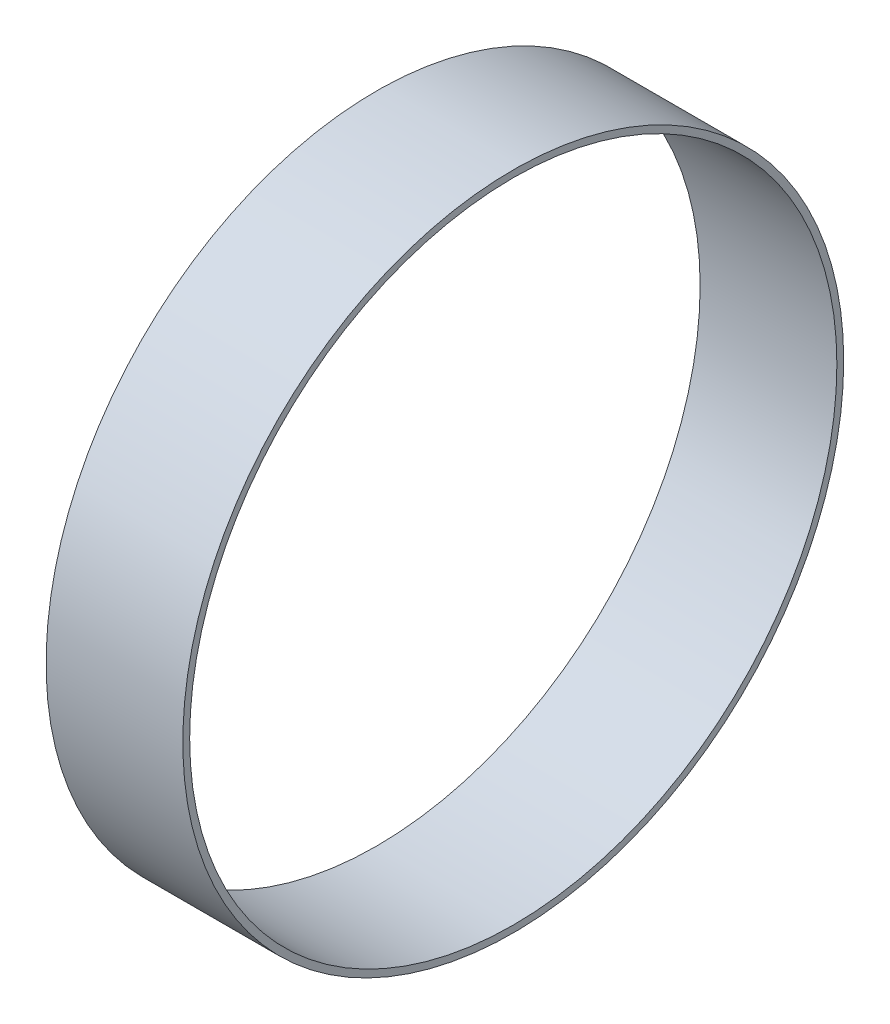
ISO-10303-21;
HEADER;
FILE_DESCRIPTION(('STEP AP214'),'2;1');
FILE_NAME('part.step','',(''),(''),'','','');
FILE_SCHEMA(('AUTOMOTIVE_DESIGN { 1 0 10303 214 1 1 1 1 }'));
ENDSEC;
DATA;
#1=APPLICATION_CONTEXT('core data for automotive mechanical design processes');
#2=APPLICATION_PROTOCOL_DEFINITION('international standard','automotive_design',2000,#1);
#3=PRODUCT_CONTEXT('',#1,'mechanical');
#4=PRODUCT('Part','Part','',(#3));
#5=PRODUCT_RELATED_PRODUCT_CATEGORY('part','',(#4));
#6=PRODUCT_DEFINITION_FORMATION('','',#4);
#7=PRODUCT_DEFINITION_CONTEXT('part definition',#1,'design');
#8=PRODUCT_DEFINITION('design','',#6,#7);
#9=PRODUCT_DEFINITION_SHAPE('','',#8);
#10=(LENGTH_UNIT() NAMED_UNIT(*) SI_UNIT(.MILLI.,.METRE.));
#11=(NAMED_UNIT(*) PLANE_ANGLE_UNIT() SI_UNIT($,.RADIAN.));
#12=(NAMED_UNIT(*) SI_UNIT($,.STERADIAN.) SOLID_ANGLE_UNIT());
#13=UNCERTAINTY_MEASURE_WITH_UNIT(LENGTH_MEASURE(1.E-05),#10,'distance_accuracy_value','');
#14=(GEOMETRIC_REPRESENTATION_CONTEXT(3) GLOBAL_UNCERTAINTY_ASSIGNED_CONTEXT((#13)) GLOBAL_UNIT_ASSIGNED_CONTEXT((#10,
#11,#12)) REPRESENTATION_CONTEXT('',''));
#15=CARTESIAN_POINT('',(0.,0.,0.));
#16=DIRECTION('',(0.,0.,1.));
#17=DIRECTION('',(1.,0.,0.));
#18=AXIS2_PLACEMENT_3D('',#15,#16,#17);
#19=CARTESIAN_POINT('',(30.,0.,0.));
#20=DIRECTION('',(1.,0.,0.));
#21=DIRECTION('',(0.,0.,-1.));
#22=AXIS2_PLACEMENT_3D('',#19,#20,#21);
#23=PLANE('',#22);
#24=CARTESIAN_POINT('',(30.,0.,0.));
#25=DIRECTION('',(1.,0.,0.));
#26=DIRECTION('',(0.,0.,-1.));
#27=AXIS2_PLACEMENT_3D('',#24,#25,#26);
#28=CIRCLE('',#27,72.5);
#29=CARTESIAN_POINT('',(30.,0.,-72.5));
#30=VERTEX_POINT('',#29);
#31=EDGE_CURVE('E10',#30,#30,#28,.T.);
#32=ORIENTED_EDGE('',*,*,#31,.T.);
#33=EDGE_LOOP('',(#32));
#34=FACE_BOUND('',#33,.T.);
#35=CARTESIAN_POINT('',(30.,0.,0.));
#36=DIRECTION('',(1.,0.,0.));
#37=DIRECTION('',(0.,0.,-1.));
#38=AXIS2_PLACEMENT_3D('',#35,#36,#37);
#39=CIRCLE('',#38,71.);
#40=CARTESIAN_POINT('',(30.,0.,-71.));
#41=VERTEX_POINT('',#40);
#42=EDGE_CURVE('E44',#41,#41,#39,.T.);
#43=ORIENTED_EDGE('',*,*,#42,.F.);
#44=EDGE_LOOP('',(#43));
#45=FACE_BOUND('',#44,.T.);
#46=ADVANCED_FACE('F33',(#34,#45),#23,.T.);
#47=CARTESIAN_POINT('',(0.,0.,0.));
#48=DIRECTION('',(1.,0.,0.));
#49=DIRECTION('',(0.,0.,-1.));
#50=AXIS2_PLACEMENT_3D('',#47,#48,#49);
#51=PLANE('',#50);
#52=CARTESIAN_POINT('',(0.,0.,0.));
#53=DIRECTION('',(1.,0.,0.));
#54=DIRECTION('',(0.,0.,-1.));
#55=AXIS2_PLACEMENT_3D('',#52,#53,#54);
#56=CIRCLE('',#55,72.5);
#57=CARTESIAN_POINT('',(0.,0.,-72.5));
#58=VERTEX_POINT('',#57);
#59=EDGE_CURVE('E37',#58,#58,#56,.T.);
#60=ORIENTED_EDGE('',*,*,#59,.F.);
#61=EDGE_LOOP('',(#60));
#62=FACE_BOUND('',#61,.T.);
#63=CARTESIAN_POINT('',(0.,0.,0.));
#64=DIRECTION('',(1.,0.,0.));
#65=DIRECTION('',(0.,0.,-1.));
#66=AXIS2_PLACEMENT_3D('',#63,#64,#65);
#67=CIRCLE('',#66,71.);
#68=CARTESIAN_POINT('',(0.,0.,-71.));
#69=VERTEX_POINT('',#68);
#70=EDGE_CURVE('E46',#69,#69,#67,.T.);
#71=ORIENTED_EDGE('',*,*,#70,.T.);
#72=EDGE_LOOP('',(#71));
#73=FACE_BOUND('',#72,.T.);
#74=ADVANCED_FACE('F56',(#62,#73),#51,.F.);
#75=CARTESIAN_POINT('',(30.,0.,0.));
#76=DIRECTION('',(-1.,0.,0.));
#77=DIRECTION('',(0.,0.,1.));
#78=AXIS2_PLACEMENT_3D('',#75,#76,#77);
#79=CYLINDRICAL_SURFACE('',#78,72.5);
#80=ORIENTED_EDGE('',*,*,#31,.F.);
#81=EDGE_LOOP('',(#80));
#82=FACE_BOUND('',#81,.T.);
#83=ORIENTED_EDGE('',*,*,#59,.T.);
#84=EDGE_LOOP('',(#83));
#85=FACE_BOUND('',#84,.T.);
#86=ADVANCED_FACE('F35',(#82,#85),#79,.T.);
#87=CARTESIAN_POINT('',(30.,0.,0.));
#88=DIRECTION('',(-1.,0.,0.));
#89=DIRECTION('',(0.,0.,1.));
#90=AXIS2_PLACEMENT_3D('',#87,#88,#89);
#91=CYLINDRICAL_SURFACE('',#90,71.);
#92=ORIENTED_EDGE('',*,*,#42,.T.);
#93=EDGE_LOOP('',(#92));
#94=FACE_BOUND('',#93,.T.);
#95=ORIENTED_EDGE('',*,*,#70,.F.);
#96=EDGE_LOOP('',(#95));
#97=FACE_BOUND('',#96,.T.);
#98=ADVANCED_FACE('F52',(#94,#97),#91,.F.);
#99=CLOSED_SHELL('',(#46,#74,#86,#98));
#100=MANIFOLD_SOLID_BREP('B2',#99);
#101=ADVANCED_BREP_SHAPE_REPRESENTATION('',(#18,#100),#14);
#102=SHAPE_DEFINITION_REPRESENTATION(#9,#101);
ENDSEC;
END-ISO-10303-21;
